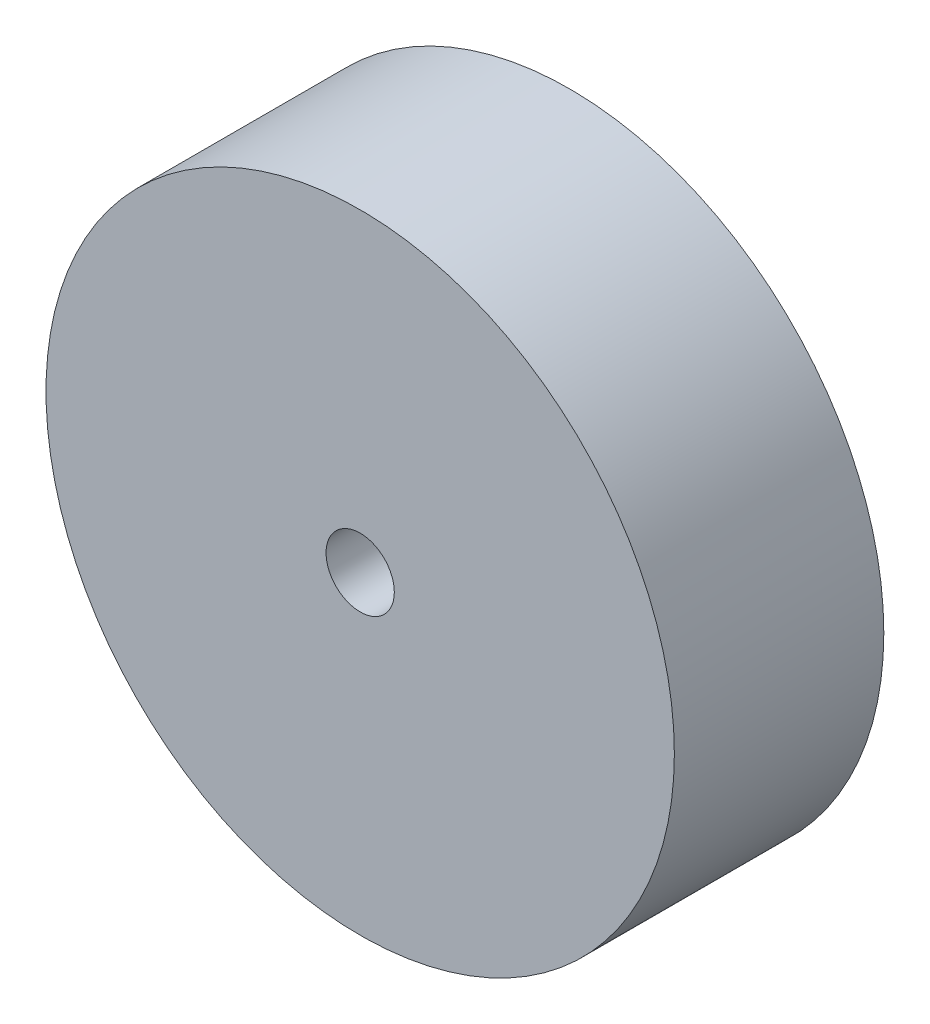
ISO-10303-21;
HEADER;
FILE_DESCRIPTION(('STEP AP214'),'2;1');
FILE_NAME('part.step','',(''),(''),'','','');
FILE_SCHEMA(('AUTOMOTIVE_DESIGN { 1 0 10303 214 1 1 1 1 }'));
ENDSEC;
DATA;
#1=APPLICATION_CONTEXT('core data for automotive mechanical design processes');
#2=APPLICATION_PROTOCOL_DEFINITION('international standard','automotive_design',2000,#1);
#3=PRODUCT_CONTEXT('',#1,'mechanical');
#4=PRODUCT('Part','Part','',(#3));
#5=PRODUCT_RELATED_PRODUCT_CATEGORY('part','',(#4));
#6=PRODUCT_DEFINITION_FORMATION('','',#4);
#7=PRODUCT_DEFINITION_CONTEXT('part definition',#1,'design');
#8=PRODUCT_DEFINITION('design','',#6,#7);
#9=PRODUCT_DEFINITION_SHAPE('','',#8);
#10=(LENGTH_UNIT() NAMED_UNIT(*) SI_UNIT(.MILLI.,.METRE.));
#11=(NAMED_UNIT(*) PLANE_ANGLE_UNIT() SI_UNIT($,.RADIAN.));
#12=(NAMED_UNIT(*) SI_UNIT($,.STERADIAN.) SOLID_ANGLE_UNIT());
#13=UNCERTAINTY_MEASURE_WITH_UNIT(LENGTH_MEASURE(1.E-05),#10,'distance_accuracy_value','');
#14=(GEOMETRIC_REPRESENTATION_CONTEXT(3) GLOBAL_UNCERTAINTY_ASSIGNED_CONTEXT((#13)) GLOBAL_UNIT_ASSIGNED_CONTEXT((#10,
#11,#12)) REPRESENTATION_CONTEXT('',''));
#15=CARTESIAN_POINT('',(0.,0.,0.));
#16=DIRECTION('',(0.,0.,1.));
#17=DIRECTION('',(1.,0.,0.));
#18=AXIS2_PLACEMENT_3D('',#15,#16,#17);
#19=CARTESIAN_POINT('',(0.,0.,5.));
#20=DIRECTION('',(0.,0.,1.));
#21=DIRECTION('',(1.,0.,0.));
#22=AXIS2_PLACEMENT_3D('',#19,#20,#21);
#23=PLANE('',#22);
#24=CARTESIAN_POINT('',(0.,0.,5.));
#25=DIRECTION('',(0.,0.,1.));
#26=DIRECTION('',(1.,0.,0.));
#27=AXIS2_PLACEMENT_3D('',#24,#25,#26);
#28=CIRCLE('',#27,7.5);
#29=CARTESIAN_POINT('',(7.5,0.,5.));
#30=VERTEX_POINT('',#29);
#31=EDGE_CURVE('E10',#30,#30,#28,.T.);
#32=ORIENTED_EDGE('',*,*,#31,.T.);
#33=EDGE_LOOP('',(#32));
#34=FACE_BOUND('',#33,.T.);
#35=CARTESIAN_POINT('',(0.,0.,5.));
#36=DIRECTION('',(0.,0.,1.));
#37=DIRECTION('',(1.,0.,0.));
#38=AXIS2_PLACEMENT_3D('',#35,#36,#37);
#39=CIRCLE('',#38,0.815);
#40=CARTESIAN_POINT('',(0.815,0.,5.));
#41=VERTEX_POINT('',#40);
#42=EDGE_CURVE('E47',#41,#41,#39,.T.);
#43=ORIENTED_EDGE('',*,*,#42,.F.);
#44=EDGE_LOOP('',(#43));
#45=FACE_BOUND('',#44,.T.);
#46=ADVANCED_FACE('F36',(#34,#45),#23,.T.);
#47=CARTESIAN_POINT('',(0.,0.,0.));
#48=DIRECTION('',(0.,0.,1.));
#49=DIRECTION('',(1.,0.,0.));
#50=AXIS2_PLACEMENT_3D('',#47,#48,#49);
#51=PLANE('',#50);
#52=CARTESIAN_POINT('',(0.,0.,0.));
#53=DIRECTION('',(0.,0.,1.));
#54=DIRECTION('',(1.,0.,0.));
#55=AXIS2_PLACEMENT_3D('',#52,#53,#54);
#56=CIRCLE('',#55,7.5);
#57=CARTESIAN_POINT('',(7.5,0.,0.));
#58=VERTEX_POINT('',#57);
#59=EDGE_CURVE('E40',#58,#58,#56,.T.);
#60=ORIENTED_EDGE('',*,*,#59,.F.);
#61=EDGE_LOOP('',(#60));
#62=FACE_BOUND('',#61,.T.);
#63=CARTESIAN_POINT('',(0.,0.,0.));
#64=DIRECTION('',(0.,0.,1.));
#65=DIRECTION('',(1.,0.,0.));
#66=AXIS2_PLACEMENT_3D('',#63,#64,#65);
#67=CIRCLE('',#66,0.815);
#68=CARTESIAN_POINT('',(0.815,0.,0.));
#69=VERTEX_POINT('',#68);
#70=EDGE_CURVE('E49',#69,#69,#67,.T.);
#71=ORIENTED_EDGE('',*,*,#70,.T.);
#72=EDGE_LOOP('',(#71));
#73=FACE_BOUND('',#72,.T.);
#74=ADVANCED_FACE('F59',(#62,#73),#51,.F.);
#75=CARTESIAN_POINT('',(0.,0.,5.));
#76=DIRECTION('',(0.,0.,-1.));
#77=DIRECTION('',(-1.,0.,0.));
#78=AXIS2_PLACEMENT_3D('',#75,#76,#77);
#79=CYLINDRICAL_SURFACE('',#78,7.5);
#80=ORIENTED_EDGE('',*,*,#31,.F.);
#81=EDGE_LOOP('',(#80));
#82=FACE_BOUND('',#81,.T.);
#83=ORIENTED_EDGE('',*,*,#59,.T.);
#84=EDGE_LOOP('',(#83));
#85=FACE_BOUND('',#84,.T.);
#86=ADVANCED_FACE('F38',(#82,#85),#79,.T.);
#87=CARTESIAN_POINT('',(0.,0.,5.));
#88=DIRECTION('',(0.,0.,-1.));
#89=DIRECTION('',(-1.,0.,0.));
#90=AXIS2_PLACEMENT_3D('',#87,#88,#89);
#91=CYLINDRICAL_SURFACE('',#90,0.815);
#92=ORIENTED_EDGE('',*,*,#42,.T.);
#93=EDGE_LOOP('',(#92));
#94=FACE_BOUND('',#93,.T.);
#95=ORIENTED_EDGE('',*,*,#70,.F.);
#96=EDGE_LOOP('',(#95));
#97=FACE_BOUND('',#96,.T.);
#98=ADVANCED_FACE('F55',(#94,#97),#91,.F.);
#99=CLOSED_SHELL('',(#46,#74,#86,#98));
#100=MANIFOLD_SOLID_BREP('B2',#99);
#101=ADVANCED_BREP_SHAPE_REPRESENTATION('',(#18,#100),#14);
#102=SHAPE_DEFINITION_REPRESENTATION(#9,#101);
ENDSEC;
END-ISO-10303-21;
